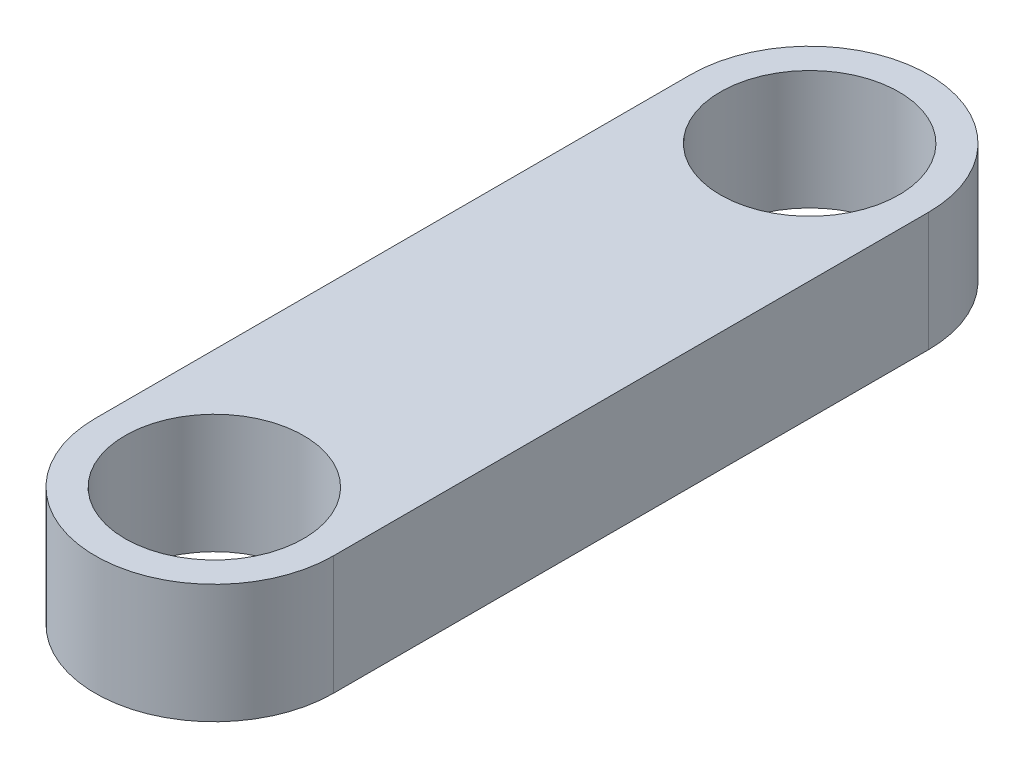
ISO-10303-21;
HEADER;
FILE_DESCRIPTION(('STEP AP214'),'2;1');
FILE_NAME('part.step','',(''),(''),'','','');
FILE_SCHEMA(('AUTOMOTIVE_DESIGN { 1 0 10303 214 1 1 1 1 }'));
ENDSEC;
DATA;
#1=APPLICATION_CONTEXT('core data for automotive mechanical design processes');
#2=APPLICATION_PROTOCOL_DEFINITION('international standard','automotive_design',2000,#1);
#3=PRODUCT_CONTEXT('',#1,'mechanical');
#4=PRODUCT('Part','Part','',(#3));
#5=PRODUCT_RELATED_PRODUCT_CATEGORY('part','',(#4));
#6=PRODUCT_DEFINITION_FORMATION('','',#4);
#7=PRODUCT_DEFINITION_CONTEXT('part definition',#1,'design');
#8=PRODUCT_DEFINITION('design','',#6,#7);
#9=PRODUCT_DEFINITION_SHAPE('','',#8);
#10=(LENGTH_UNIT() NAMED_UNIT(*) SI_UNIT(.MILLI.,.METRE.));
#11=(NAMED_UNIT(*) PLANE_ANGLE_UNIT() SI_UNIT($,.RADIAN.));
#12=(NAMED_UNIT(*) SI_UNIT($,.STERADIAN.) SOLID_ANGLE_UNIT());
#13=UNCERTAINTY_MEASURE_WITH_UNIT(LENGTH_MEASURE(1.E-05),#10,'distance_accuracy_value','');
#14=(GEOMETRIC_REPRESENTATION_CONTEXT(3) GLOBAL_UNCERTAINTY_ASSIGNED_CONTEXT((#13)) GLOBAL_UNIT_ASSIGNED_CONTEXT((#10,
#11,#12)) REPRESENTATION_CONTEXT('',''));
#15=CARTESIAN_POINT('',(0.,0.,0.));
#16=DIRECTION('',(0.,0.,1.));
#17=DIRECTION('',(1.,0.,0.));
#18=AXIS2_PLACEMENT_3D('',#15,#16,#17);
#19=CARTESIAN_POINT('',(0.,2.,-5.));
#20=DIRECTION('',(0.,-1.,0.));
#21=DIRECTION('',(0.,0.,-1.));
#22=AXIS2_PLACEMENT_3D('',#19,#20,#21);
#23=CYLINDRICAL_SURFACE('',#22,2.);
#24=CARTESIAN_POINT('',(0.,0.,-5.));
#25=DIRECTION('',(0.,1.,0.));
#26=DIRECTION('',(0.,0.,1.));
#27=AXIS2_PLACEMENT_3D('',#24,#25,#26);
#28=CIRCLE('',#27,2.);
#29=CARTESIAN_POINT('',(2.,0.,-5.));
#30=VERTEX_POINT('',#29);
#31=CARTESIAN_POINT('',(-2.,0.,-5.));
#32=VERTEX_POINT('',#31);
#33=EDGE_CURVE('E126',#30,#32,#28,.T.);
#34=ORIENTED_EDGE('',*,*,#33,.T.);
#35=DIRECTION('',(0.,-1.,0.));
#36=VECTOR('',#35,1.);
#37=CARTESIAN_POINT('',(-2.,2.,-5.));
#38=LINE('',#37,#36);
#39=CARTESIAN_POINT('',(-2.,2.,-5.));
#40=VERTEX_POINT('',#39);
#41=EDGE_CURVE('E11',#40,#32,#38,.T.);
#42=ORIENTED_EDGE('',*,*,#41,.F.);
#43=CARTESIAN_POINT('',(0.,2.,-5.));
#44=DIRECTION('',(0.,1.,0.));
#45=DIRECTION('',(0.,0.,1.));
#46=AXIS2_PLACEMENT_3D('',#43,#44,#45);
#47=CIRCLE('',#46,2.);
#48=CARTESIAN_POINT('',(2.,2.,-5.));
#49=VERTEX_POINT('',#48);
#50=EDGE_CURVE('E89',#49,#40,#47,.T.);
#51=ORIENTED_EDGE('',*,*,#50,.F.);
#52=DIRECTION('',(0.,-1.,0.));
#53=VECTOR('',#52,1.);
#54=CARTESIAN_POINT('',(2.,2.,-5.));
#55=LINE('',#54,#53);
#56=EDGE_CURVE('E121',#49,#30,#55,.T.);
#57=ORIENTED_EDGE('',*,*,#56,.T.);
#58=EDGE_LOOP('',(#34,#42,#51,#57));
#59=FACE_BOUND('',#58,.T.);
#60=ADVANCED_FACE('F45',(#59),#23,.T.);
#61=CARTESIAN_POINT('',(-2.,2.,0.));
#62=DIRECTION('',(-1.,0.,0.));
#63=DIRECTION('',(0.,0.,1.));
#64=AXIS2_PLACEMENT_3D('',#61,#62,#63);
#65=PLANE('',#64);
#66=DIRECTION('',(0.,0.,-1.));
#67=VECTOR('',#66,1.);
#68=CARTESIAN_POINT('',(-2.,0.,0.));
#69=LINE('',#68,#67);
#70=CARTESIAN_POINT('',(-2.,0.,5.));
#71=VERTEX_POINT('',#70);
#72=EDGE_CURVE('E99',#71,#32,#69,.T.);
#73=ORIENTED_EDGE('',*,*,#72,.F.);
#74=DIRECTION('',(0.,-1.,0.));
#75=VECTOR('',#74,1.);
#76=CARTESIAN_POINT('',(-2.,2.,5.));
#77=LINE('',#76,#75);
#78=CARTESIAN_POINT('',(-2.,2.,5.));
#79=VERTEX_POINT('',#78);
#80=EDGE_CURVE('E55',#79,#71,#77,.T.);
#81=ORIENTED_EDGE('',*,*,#80,.F.);
#82=DIRECTION('',(0.,0.,-1.));
#83=VECTOR('',#82,1.);
#84=CARTESIAN_POINT('',(-2.,2.,0.));
#85=LINE('',#84,#83);
#86=EDGE_CURVE('E97',#79,#40,#85,.T.);
#87=ORIENTED_EDGE('',*,*,#86,.T.);
#88=ORIENTED_EDGE('',*,*,#41,.T.);
#89=EDGE_LOOP('',(#73,#81,#87,#88));
#90=FACE_BOUND('',#89,.T.);
#91=ADVANCED_FACE('F96',(#90),#65,.T.);
#92=CARTESIAN_POINT('',(0.,2.,5.));
#93=DIRECTION('',(0.,-1.,0.));
#94=DIRECTION('',(0.,0.,-1.));
#95=AXIS2_PLACEMENT_3D('',#92,#93,#94);
#96=CYLINDRICAL_SURFACE('',#95,2.);
#97=CARTESIAN_POINT('',(0.,0.,5.));
#98=DIRECTION('',(0.,1.,0.));
#99=DIRECTION('',(0.,0.,1.));
#100=AXIS2_PLACEMENT_3D('',#97,#98,#99);
#101=CIRCLE('',#100,2.);
#102=CARTESIAN_POINT('',(2.,0.,5.));
#103=VERTEX_POINT('',#102);
#104=EDGE_CURVE('E78',#71,#103,#101,.T.);
#105=ORIENTED_EDGE('',*,*,#104,.T.);
#106=DIRECTION('',(0.,-1.,0.));
#107=VECTOR('',#106,1.);
#108=CARTESIAN_POINT('',(2.,2.,5.));
#109=LINE('',#108,#107);
#110=CARTESIAN_POINT('',(2.,2.,5.));
#111=VERTEX_POINT('',#110);
#112=EDGE_CURVE('E101',#111,#103,#109,.T.);
#113=ORIENTED_EDGE('',*,*,#112,.F.);
#114=CARTESIAN_POINT('',(0.,2.,5.));
#115=DIRECTION('',(0.,1.,0.));
#116=DIRECTION('',(0.,0.,1.));
#117=AXIS2_PLACEMENT_3D('',#114,#115,#116);
#118=CIRCLE('',#117,2.);
#119=EDGE_CURVE('E102',#79,#111,#118,.T.);
#120=ORIENTED_EDGE('',*,*,#119,.F.);
#121=ORIENTED_EDGE('',*,*,#80,.T.);
#122=EDGE_LOOP('',(#105,#113,#120,#121));
#123=FACE_BOUND('',#122,.T.);
#124=ADVANCED_FACE('F103',(#123),#96,.T.);
#125=CARTESIAN_POINT('',(2.,2.,0.));
#126=DIRECTION('',(-1.,0.,0.));
#127=DIRECTION('',(0.,0.,1.));
#128=AXIS2_PLACEMENT_3D('',#125,#126,#127);
#129=PLANE('',#128);
#130=DIRECTION('',(0.,0.,-1.));
#131=VECTOR('',#130,1.);
#132=CARTESIAN_POINT('',(2.,0.,0.));
#133=LINE('',#132,#131);
#134=EDGE_CURVE('E84',#103,#30,#133,.T.);
#135=ORIENTED_EDGE('',*,*,#134,.T.);
#136=ORIENTED_EDGE('',*,*,#56,.F.);
#137=DIRECTION('',(0.,0.,-1.));
#138=VECTOR('',#137,1.);
#139=CARTESIAN_POINT('',(2.,2.,0.));
#140=LINE('',#139,#138);
#141=EDGE_CURVE('E63',#111,#49,#140,.T.);
#142=ORIENTED_EDGE('',*,*,#141,.F.);
#143=ORIENTED_EDGE('',*,*,#112,.T.);
#144=EDGE_LOOP('',(#135,#136,#142,#143));
#145=FACE_BOUND('',#144,.T.);
#146=ADVANCED_FACE('F143',(#145),#129,.F.);
#147=CARTESIAN_POINT('',(0.,2.,5.));
#148=DIRECTION('',(0.,-1.,0.));
#149=DIRECTION('',(0.,0.,-1.));
#150=AXIS2_PLACEMENT_3D('',#147,#148,#149);
#151=CYLINDRICAL_SURFACE('',#150,1.5);
#152=CARTESIAN_POINT('',(0.,2.,5.));
#153=DIRECTION('',(0.,1.,0.));
#154=DIRECTION('',(0.,0.,1.));
#155=AXIS2_PLACEMENT_3D('',#152,#153,#154);
#156=CIRCLE('',#155,1.5);
#157=CARTESIAN_POINT('',(0.,2.,6.5));
#158=VERTEX_POINT('',#157);
#159=EDGE_CURVE('E111',#158,#158,#156,.T.);
#160=ORIENTED_EDGE('',*,*,#159,.T.);
#161=EDGE_LOOP('',(#160));
#162=FACE_BOUND('',#161,.T.);
#163=CARTESIAN_POINT('',(0.,0.,5.));
#164=DIRECTION('',(0.,1.,0.));
#165=DIRECTION('',(0.,0.,1.));
#166=AXIS2_PLACEMENT_3D('',#163,#164,#165);
#167=CIRCLE('',#166,1.5);
#168=CARTESIAN_POINT('',(0.,0.,6.5));
#169=VERTEX_POINT('',#168);
#170=EDGE_CURVE('E122',#169,#169,#167,.T.);
#171=ORIENTED_EDGE('',*,*,#170,.F.);
#172=EDGE_LOOP('',(#171));
#173=FACE_BOUND('',#172,.T.);
#174=ADVANCED_FACE('F47',(#162,#173),#151,.F.);
#175=CARTESIAN_POINT('',(0.,2.,-5.));
#176=DIRECTION('',(0.,-1.,0.));
#177=DIRECTION('',(0.,0.,-1.));
#178=AXIS2_PLACEMENT_3D('',#175,#176,#177);
#179=CYLINDRICAL_SURFACE('',#178,1.5);
#180=CARTESIAN_POINT('',(0.,2.,-5.));
#181=DIRECTION('',(0.,1.,0.));
#182=DIRECTION('',(0.,0.,1.));
#183=AXIS2_PLACEMENT_3D('',#180,#181,#182);
#184=CIRCLE('',#183,1.5);
#185=CARTESIAN_POINT('',(0.,2.,-3.5));
#186=VERTEX_POINT('',#185);
#187=EDGE_CURVE('E117',#186,#186,#184,.T.);
#188=ORIENTED_EDGE('',*,*,#187,.T.);
#189=EDGE_LOOP('',(#188));
#190=FACE_BOUND('',#189,.T.);
#191=CARTESIAN_POINT('',(0.,0.,-5.));
#192=DIRECTION('',(0.,1.,0.));
#193=DIRECTION('',(0.,0.,1.));
#194=AXIS2_PLACEMENT_3D('',#191,#192,#193);
#195=CIRCLE('',#194,1.5);
#196=CARTESIAN_POINT('',(0.,0.,-3.5));
#197=VERTEX_POINT('',#196);
#198=EDGE_CURVE('E136',#197,#197,#195,.T.);
#199=ORIENTED_EDGE('',*,*,#198,.F.);
#200=EDGE_LOOP('',(#199));
#201=FACE_BOUND('',#200,.T.);
#202=ADVANCED_FACE('F159',(#190,#201),#179,.F.);
#203=CARTESIAN_POINT('',(0.,2.,0.));
#204=DIRECTION('',(0.,1.,0.));
#205=DIRECTION('',(0.,0.,1.));
#206=AXIS2_PLACEMENT_3D('',#203,#204,#205);
#207=PLANE('',#206);
#208=ORIENTED_EDGE('',*,*,#159,.F.);
#209=EDGE_LOOP('',(#208));
#210=FACE_BOUND('',#209,.T.);
#211=ORIENTED_EDGE('',*,*,#50,.T.);
#212=ORIENTED_EDGE('',*,*,#86,.F.);
#213=ORIENTED_EDGE('',*,*,#119,.T.);
#214=ORIENTED_EDGE('',*,*,#141,.T.);
#215=EDGE_LOOP('',(#211,#212,#213,#214));
#216=FACE_BOUND('',#215,.T.);
#217=ORIENTED_EDGE('',*,*,#187,.F.);
#218=EDGE_LOOP('',(#217));
#219=FACE_BOUND('',#218,.T.);
#220=ADVANCED_FACE('F106',(#210,#216,#219),#207,.T.);
#221=CARTESIAN_POINT('',(0.,0.,0.));
#222=DIRECTION('',(0.,1.,0.));
#223=DIRECTION('',(0.,0.,1.));
#224=AXIS2_PLACEMENT_3D('',#221,#222,#223);
#225=PLANE('',#224);
#226=ORIENTED_EDGE('',*,*,#170,.T.);
#227=EDGE_LOOP('',(#226));
#228=FACE_BOUND('',#227,.T.);
#229=ORIENTED_EDGE('',*,*,#33,.F.);
#230=ORIENTED_EDGE('',*,*,#134,.F.);
#231=ORIENTED_EDGE('',*,*,#104,.F.);
#232=ORIENTED_EDGE('',*,*,#72,.T.);
#233=EDGE_LOOP('',(#229,#230,#231,#232));
#234=FACE_BOUND('',#233,.T.);
#235=ORIENTED_EDGE('',*,*,#198,.T.);
#236=EDGE_LOOP('',(#235));
#237=FACE_BOUND('',#236,.T.);
#238=ADVANCED_FACE('F146',(#228,#234,#237),#225,.F.);
#239=CLOSED_SHELL('',(#60,#91,#124,#146,#174,#202,#220,#238));
#240=MANIFOLD_SOLID_BREP('B2',#239);
#241=ADVANCED_BREP_SHAPE_REPRESENTATION('',(#18,#240),#14);
#242=SHAPE_DEFINITION_REPRESENTATION(#9,#241);
ENDSEC;
END-ISO-10303-21;
